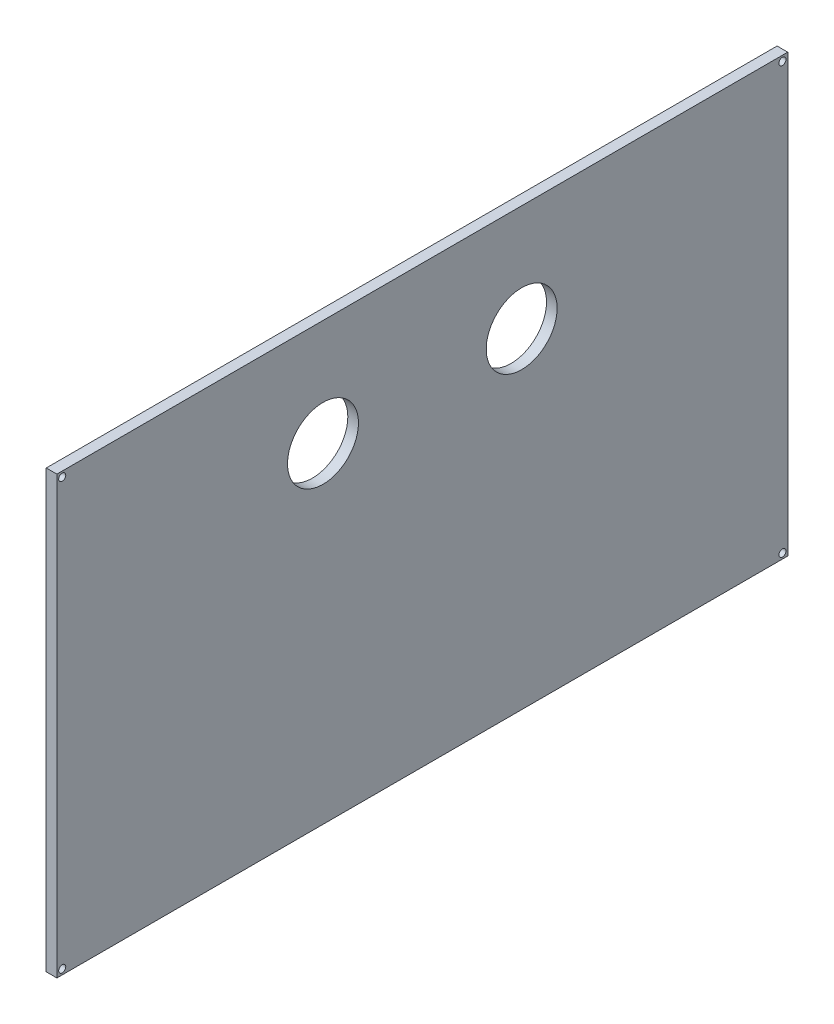
ISO-10303-21;
HEADER;
FILE_DESCRIPTION(('STEP AP214'),'2;1');
FILE_NAME('part.step','',(''),(''),'','','');
FILE_SCHEMA(('AUTOMOTIVE_DESIGN { 1 0 10303 214 1 1 1 1 }'));
ENDSEC;
DATA;
#1=APPLICATION_CONTEXT('core data for automotive mechanical design processes');
#2=APPLICATION_PROTOCOL_DEFINITION('international standard','automotive_design',2000,#1);
#3=PRODUCT_CONTEXT('',#1,'mechanical');
#4=PRODUCT('Part','Part','',(#3));
#5=PRODUCT_RELATED_PRODUCT_CATEGORY('part','',(#4));
#6=PRODUCT_DEFINITION_FORMATION('','',#4);
#7=PRODUCT_DEFINITION_CONTEXT('part definition',#1,'design');
#8=PRODUCT_DEFINITION('design','',#6,#7);
#9=PRODUCT_DEFINITION_SHAPE('','',#8);
#10=(LENGTH_UNIT() NAMED_UNIT(*) SI_UNIT(.MILLI.,.METRE.));
#11=(NAMED_UNIT(*) PLANE_ANGLE_UNIT() SI_UNIT($,.RADIAN.));
#12=(NAMED_UNIT(*) SI_UNIT($,.STERADIAN.) SOLID_ANGLE_UNIT());
#13=UNCERTAINTY_MEASURE_WITH_UNIT(LENGTH_MEASURE(1.E-05),#10,'distance_accuracy_value','');
#14=(GEOMETRIC_REPRESENTATION_CONTEXT(3) GLOBAL_UNCERTAINTY_ASSIGNED_CONTEXT((#13)) GLOBAL_UNIT_ASSIGNED_CONTEXT((#10,
#11,#12)) REPRESENTATION_CONTEXT('',''));
#15=CARTESIAN_POINT('',(0.,0.,0.));
#16=DIRECTION('',(0.,0.,1.));
#17=DIRECTION('',(1.,0.,0.));
#18=AXIS2_PLACEMENT_3D('',#15,#16,#17);
#19=CARTESIAN_POINT('',(3.,0.,0.));
#20=DIRECTION('',(-1.,0.,0.));
#21=DIRECTION('',(0.,0.,1.));
#22=AXIS2_PLACEMENT_3D('',#19,#20,#21);
#23=PLANE('',#22);
#24=DIRECTION('',(0.,-1.,0.));
#25=VECTOR('',#24,1.);
#26=CARTESIAN_POINT('',(3.,0.,0.));
#27=LINE('',#26,#25);
#28=CARTESIAN_POINT('',(3.,123.,0.));
#29=VERTEX_POINT('',#28);
#30=CARTESIAN_POINT('',(3.,0.,0.));
#31=VERTEX_POINT('',#30);
#32=EDGE_CURVE('E91',#29,#31,#27,.T.);
#33=ORIENTED_EDGE('',*,*,#32,.T.);
#34=DIRECTION('',(0.,0.,-1.));
#35=VECTOR('',#34,1.);
#36=CARTESIAN_POINT('',(3.,0.,0.));
#37=LINE('',#36,#35);
#38=CARTESIAN_POINT('',(3.,0.,-206.));
#39=VERTEX_POINT('',#38);
#40=EDGE_CURVE('E86',#31,#39,#37,.T.);
#41=ORIENTED_EDGE('',*,*,#40,.T.);
#42=DIRECTION('',(0.,1.,0.));
#43=VECTOR('',#42,1.);
#44=CARTESIAN_POINT('',(3.,0.,-206.));
#45=LINE('',#44,#43);
#46=CARTESIAN_POINT('',(3.,123.,-206.));
#47=VERTEX_POINT('',#46);
#48=EDGE_CURVE('E89',#39,#47,#45,.T.);
#49=ORIENTED_EDGE('',*,*,#48,.T.);
#50=DIRECTION('',(0.,0.,1.));
#51=VECTOR('',#50,1.);
#52=CARTESIAN_POINT('',(3.,123.,0.));
#53=LINE('',#52,#51);
#54=EDGE_CURVE('E56',#47,#29,#53,.T.);
#55=ORIENTED_EDGE('',*,*,#54,.T.);
#56=EDGE_LOOP('',(#33,#41,#49,#55));
#57=FACE_BOUND('',#56,.T.);
#58=CARTESIAN_POINT('',(3.,93.,-75.));
#59=DIRECTION('',(1.,0.,0.));
#60=DIRECTION('',(0.,0.,-1.));
#61=AXIS2_PLACEMENT_3D('',#58,#59,#60);
#62=CIRCLE('',#61,9.99999999999999);
#63=CARTESIAN_POINT('',(3.,93.,-85.));
#64=VERTEX_POINT('',#63);
#65=EDGE_CURVE('E106',#64,#64,#62,.T.);
#66=ORIENTED_EDGE('',*,*,#65,.F.);
#67=EDGE_LOOP('',(#66));
#68=FACE_BOUND('',#67,.T.);
#69=CARTESIAN_POINT('',(3.,93.,-131.));
#70=DIRECTION('',(1.,0.,0.));
#71=DIRECTION('',(0.,0.,-1.));
#72=AXIS2_PLACEMENT_3D('',#69,#70,#71);
#73=CIRCLE('',#72,10.);
#74=CARTESIAN_POINT('',(3.,93.,-141.));
#75=VERTEX_POINT('',#74);
#76=EDGE_CURVE('E121',#75,#75,#73,.T.);
#77=ORIENTED_EDGE('',*,*,#76,.F.);
#78=EDGE_LOOP('',(#77));
#79=FACE_BOUND('',#78,.T.);
#80=CARTESIAN_POINT('',(3.,1.5,-204.5));
#81=DIRECTION('',(1.,0.,0.));
#82=DIRECTION('',(0.,0.,-1.));
#83=AXIS2_PLACEMENT_3D('',#80,#81,#82);
#84=CIRCLE('',#83,0.999999999999998);
#85=CARTESIAN_POINT('',(3.,1.5,-205.5));
#86=VERTEX_POINT('',#85);
#87=EDGE_CURVE('E127',#86,#86,#84,.T.);
#88=ORIENTED_EDGE('',*,*,#87,.F.);
#89=EDGE_LOOP('',(#88));
#90=FACE_BOUND('',#89,.T.);
#91=CARTESIAN_POINT('',(3.,1.5,-1.5));
#92=DIRECTION('',(1.,0.,0.));
#93=DIRECTION('',(0.,0.,-1.));
#94=AXIS2_PLACEMENT_3D('',#91,#92,#93);
#95=CIRCLE('',#94,1.);
#96=CARTESIAN_POINT('',(3.,1.5,-2.5));
#97=VERTEX_POINT('',#96);
#98=EDGE_CURVE('E133',#97,#97,#95,.T.);
#99=ORIENTED_EDGE('',*,*,#98,.F.);
#100=EDGE_LOOP('',(#99));
#101=FACE_BOUND('',#100,.T.);
#102=CARTESIAN_POINT('',(3.,121.5,-204.5));
#103=DIRECTION('',(1.,0.,0.));
#104=DIRECTION('',(0.,0.,-1.));
#105=AXIS2_PLACEMENT_3D('',#102,#103,#104);
#106=CIRCLE('',#105,0.999999999999998);
#107=CARTESIAN_POINT('',(3.,121.5,-205.5));
#108=VERTEX_POINT('',#107);
#109=EDGE_CURVE('E139',#108,#108,#106,.T.);
#110=ORIENTED_EDGE('',*,*,#109,.F.);
#111=EDGE_LOOP('',(#110));
#112=FACE_BOUND('',#111,.T.);
#113=CARTESIAN_POINT('',(3.,121.5,-1.5));
#114=DIRECTION('',(1.,0.,0.));
#115=DIRECTION('',(0.,0.,-1.));
#116=AXIS2_PLACEMENT_3D('',#113,#114,#115);
#117=CIRCLE('',#116,1.);
#118=CARTESIAN_POINT('',(3.,121.5,-2.5));
#119=VERTEX_POINT('',#118);
#120=EDGE_CURVE('E145',#119,#119,#117,.T.);
#121=ORIENTED_EDGE('',*,*,#120,.F.);
#122=EDGE_LOOP('',(#121));
#123=FACE_BOUND('',#122,.T.);
#124=ADVANCED_FACE('F39',(#57,#68,#79,#90,#101,#112,#123),#23,.F.);
#125=CARTESIAN_POINT('',(0.,0.,0.));
#126=DIRECTION('',(-1.,0.,0.));
#127=DIRECTION('',(0.,0.,1.));
#128=AXIS2_PLACEMENT_3D('',#125,#126,#127);
#129=PLANE('',#128);
#130=CARTESIAN_POINT('',(0.,121.5,-204.5));
#131=DIRECTION('',(1.,0.,0.));
#132=DIRECTION('',(0.,0.,-1.));
#133=AXIS2_PLACEMENT_3D('',#130,#131,#132);
#134=CIRCLE('',#133,0.999999999999998);
#135=CARTESIAN_POINT('',(0.,121.5,-205.5));
#136=VERTEX_POINT('',#135);
#137=EDGE_CURVE('E142',#136,#136,#134,.T.);
#138=ORIENTED_EDGE('',*,*,#137,.T.);
#139=EDGE_LOOP('',(#138));
#140=FACE_BOUND('',#139,.T.);
#141=CARTESIAN_POINT('',(0.,1.5,-204.5));
#142=DIRECTION('',(1.,0.,0.));
#143=DIRECTION('',(0.,0.,-1.));
#144=AXIS2_PLACEMENT_3D('',#141,#142,#143);
#145=CIRCLE('',#144,0.999999999999998);
#146=CARTESIAN_POINT('',(0.,1.5,-205.5));
#147=VERTEX_POINT('',#146);
#148=EDGE_CURVE('E130',#147,#147,#145,.T.);
#149=ORIENTED_EDGE('',*,*,#148,.T.);
#150=EDGE_LOOP('',(#149));
#151=FACE_BOUND('',#150,.T.);
#152=CARTESIAN_POINT('',(0.,93.,-75.));
#153=DIRECTION('',(1.,0.,0.));
#154=DIRECTION('',(0.,0.,-1.));
#155=AXIS2_PLACEMENT_3D('',#152,#153,#154);
#156=CIRCLE('',#155,9.99999999999999);
#157=CARTESIAN_POINT('',(0.,93.,-85.));
#158=VERTEX_POINT('',#157);
#159=EDGE_CURVE('E118',#158,#158,#156,.T.);
#160=ORIENTED_EDGE('',*,*,#159,.T.);
#161=EDGE_LOOP('',(#160));
#162=FACE_BOUND('',#161,.T.);
#163=DIRECTION('',(0.,-1.,0.));
#164=VECTOR('',#163,1.);
#165=CARTESIAN_POINT('',(0.,0.,0.));
#166=LINE('',#165,#164);
#167=CARTESIAN_POINT('',(0.,123.,0.));
#168=VERTEX_POINT('',#167);
#169=CARTESIAN_POINT('',(0.,0.,0.));
#170=VERTEX_POINT('',#169);
#171=EDGE_CURVE('E103',#168,#170,#166,.T.);
#172=ORIENTED_EDGE('',*,*,#171,.F.);
#173=DIRECTION('',(0.,0.,1.));
#174=VECTOR('',#173,1.);
#175=CARTESIAN_POINT('',(0.,123.,0.));
#176=LINE('',#175,#174);
#177=CARTESIAN_POINT('',(0.,123.,-206.));
#178=VERTEX_POINT('',#177);
#179=EDGE_CURVE('E79',#178,#168,#176,.T.);
#180=ORIENTED_EDGE('',*,*,#179,.F.);
#181=DIRECTION('',(0.,1.,0.));
#182=VECTOR('',#181,1.);
#183=CARTESIAN_POINT('',(0.,0.,-206.));
#184=LINE('',#183,#182);
#185=CARTESIAN_POINT('',(0.,0.,-206.));
#186=VERTEX_POINT('',#185);
#187=EDGE_CURVE('E73',#186,#178,#184,.T.);
#188=ORIENTED_EDGE('',*,*,#187,.F.);
#189=DIRECTION('',(0.,0.,-1.));
#190=VECTOR('',#189,1.);
#191=CARTESIAN_POINT('',(0.,0.,0.));
#192=LINE('',#191,#190);
#193=EDGE_CURVE('E95',#170,#186,#192,.T.);
#194=ORIENTED_EDGE('',*,*,#193,.F.);
#195=EDGE_LOOP('',(#172,#180,#188,#194));
#196=FACE_BOUND('',#195,.T.);
#197=CARTESIAN_POINT('',(0.,93.,-131.));
#198=DIRECTION('',(1.,0.,0.));
#199=DIRECTION('',(0.,0.,-1.));
#200=AXIS2_PLACEMENT_3D('',#197,#198,#199);
#201=CIRCLE('',#200,10.);
#202=CARTESIAN_POINT('',(0.,93.,-141.));
#203=VERTEX_POINT('',#202);
#204=EDGE_CURVE('E124',#203,#203,#201,.T.);
#205=ORIENTED_EDGE('',*,*,#204,.T.);
#206=EDGE_LOOP('',(#205));
#207=FACE_BOUND('',#206,.T.);
#208=CARTESIAN_POINT('',(0.,1.5,-1.5));
#209=DIRECTION('',(1.,0.,0.));
#210=DIRECTION('',(0.,0.,-1.));
#211=AXIS2_PLACEMENT_3D('',#208,#209,#210);
#212=CIRCLE('',#211,1.);
#213=CARTESIAN_POINT('',(0.,1.5,-2.5));
#214=VERTEX_POINT('',#213);
#215=EDGE_CURVE('E136',#214,#214,#212,.T.);
#216=ORIENTED_EDGE('',*,*,#215,.T.);
#217=EDGE_LOOP('',(#216));
#218=FACE_BOUND('',#217,.T.);
#219=CARTESIAN_POINT('',(0.,121.5,-1.5));
#220=DIRECTION('',(1.,0.,0.));
#221=DIRECTION('',(0.,0.,-1.));
#222=AXIS2_PLACEMENT_3D('',#219,#220,#221);
#223=CIRCLE('',#222,1.);
#224=CARTESIAN_POINT('',(0.,121.5,-2.5));
#225=VERTEX_POINT('',#224);
#226=EDGE_CURVE('E148',#225,#225,#223,.T.);
#227=ORIENTED_EDGE('',*,*,#226,.T.);
#228=EDGE_LOOP('',(#227));
#229=FACE_BOUND('',#228,.T.);
#230=ADVANCED_FACE('F114',(#140,#151,#162,#196,#207,#218,#229),#129,.T.);
#231=CARTESIAN_POINT('',(3.,0.,0.));
#232=DIRECTION('',(0.,0.,-1.));
#233=DIRECTION('',(-1.,0.,0.));
#234=AXIS2_PLACEMENT_3D('',#231,#232,#233);
#235=PLANE('',#234);
#236=ORIENTED_EDGE('',*,*,#171,.T.);
#237=DIRECTION('',(-1.,0.,0.));
#238=VECTOR('',#237,1.);
#239=CARTESIAN_POINT('',(3.,0.,0.));
#240=LINE('',#239,#238);
#241=EDGE_CURVE('E11',#31,#170,#240,.T.);
#242=ORIENTED_EDGE('',*,*,#241,.F.);
#243=ORIENTED_EDGE('',*,*,#32,.F.);
#244=DIRECTION('',(-1.,0.,0.));
#245=VECTOR('',#244,1.);
#246=CARTESIAN_POINT('',(3.,123.,0.));
#247=LINE('',#246,#245);
#248=EDGE_CURVE('E99',#29,#168,#247,.T.);
#249=ORIENTED_EDGE('',*,*,#248,.T.);
#250=EDGE_LOOP('',(#236,#242,#243,#249));
#251=FACE_BOUND('',#250,.T.);
#252=ADVANCED_FACE('F41',(#251),#235,.F.);
#253=CARTESIAN_POINT('',(3.,0.,0.));
#254=DIRECTION('',(0.,1.,0.));
#255=DIRECTION('',(0.,0.,1.));
#256=AXIS2_PLACEMENT_3D('',#253,#254,#255);
#257=PLANE('',#256);
#258=ORIENTED_EDGE('',*,*,#193,.T.);
#259=DIRECTION('',(-1.,0.,0.));
#260=VECTOR('',#259,1.);
#261=CARTESIAN_POINT('',(3.,0.,-206.));
#262=LINE('',#261,#260);
#263=EDGE_CURVE('E48',#39,#186,#262,.T.);
#264=ORIENTED_EDGE('',*,*,#263,.F.);
#265=ORIENTED_EDGE('',*,*,#40,.F.);
#266=ORIENTED_EDGE('',*,*,#241,.T.);
#267=EDGE_LOOP('',(#258,#264,#265,#266));
#268=FACE_BOUND('',#267,.T.);
#269=ADVANCED_FACE('F94',(#268),#257,.F.);
#270=CARTESIAN_POINT('',(3.,0.,-206.));
#271=DIRECTION('',(0.,0.,1.));
#272=DIRECTION('',(1.,0.,0.));
#273=AXIS2_PLACEMENT_3D('',#270,#271,#272);
#274=PLANE('',#273);
#275=ORIENTED_EDGE('',*,*,#187,.T.);
#276=DIRECTION('',(-1.,0.,0.));
#277=VECTOR('',#276,1.);
#278=CARTESIAN_POINT('',(3.,123.,-206.));
#279=LINE('',#278,#277);
#280=EDGE_CURVE('E96',#47,#178,#279,.T.);
#281=ORIENTED_EDGE('',*,*,#280,.F.);
#282=ORIENTED_EDGE('',*,*,#48,.F.);
#283=ORIENTED_EDGE('',*,*,#263,.T.);
#284=EDGE_LOOP('',(#275,#281,#282,#283));
#285=FACE_BOUND('',#284,.T.);
#286=ADVANCED_FACE('F97',(#285),#274,.F.);
#287=CARTESIAN_POINT('',(3.,123.,0.));
#288=DIRECTION('',(0.,-1.,0.));
#289=DIRECTION('',(0.,0.,-1.));
#290=AXIS2_PLACEMENT_3D('',#287,#288,#289);
#291=PLANE('',#290);
#292=ORIENTED_EDGE('',*,*,#179,.T.);
#293=ORIENTED_EDGE('',*,*,#248,.F.);
#294=ORIENTED_EDGE('',*,*,#54,.F.);
#295=ORIENTED_EDGE('',*,*,#280,.T.);
#296=EDGE_LOOP('',(#292,#293,#294,#295));
#297=FACE_BOUND('',#296,.T.);
#298=ADVANCED_FACE('F111',(#297),#291,.F.);
#299=CARTESIAN_POINT('',(3.,93.,-75.));
#300=DIRECTION('',(-1.,0.,0.));
#301=DIRECTION('',(0.,0.,1.));
#302=AXIS2_PLACEMENT_3D('',#299,#300,#301);
#303=CYLINDRICAL_SURFACE('',#302,9.99999999999999);
#304=ORIENTED_EDGE('',*,*,#65,.T.);
#305=EDGE_LOOP('',(#304));
#306=FACE_BOUND('',#305,.T.);
#307=ORIENTED_EDGE('',*,*,#159,.F.);
#308=EDGE_LOOP('',(#307));
#309=FACE_BOUND('',#308,.T.);
#310=ADVANCED_FACE('F165',(#306,#309),#303,.F.);
#311=CARTESIAN_POINT('',(3.,93.,-131.));
#312=DIRECTION('',(-1.,0.,0.));
#313=DIRECTION('',(0.,0.,1.));
#314=AXIS2_PLACEMENT_3D('',#311,#312,#313);
#315=CYLINDRICAL_SURFACE('',#314,10.);
#316=ORIENTED_EDGE('',*,*,#76,.T.);
#317=EDGE_LOOP('',(#316));
#318=FACE_BOUND('',#317,.T.);
#319=ORIENTED_EDGE('',*,*,#204,.F.);
#320=EDGE_LOOP('',(#319));
#321=FACE_BOUND('',#320,.T.);
#322=ADVANCED_FACE('F210',(#318,#321),#315,.F.);
#323=CARTESIAN_POINT('',(3.,1.5,-204.5));
#324=DIRECTION('',(-1.,0.,0.));
#325=DIRECTION('',(0.,0.,1.));
#326=AXIS2_PLACEMENT_3D('',#323,#324,#325);
#327=CYLINDRICAL_SURFACE('',#326,0.999999999999998);
#328=ORIENTED_EDGE('',*,*,#87,.T.);
#329=EDGE_LOOP('',(#328));
#330=FACE_BOUND('',#329,.T.);
#331=ORIENTED_EDGE('',*,*,#148,.F.);
#332=EDGE_LOOP('',(#331));
#333=FACE_BOUND('',#332,.T.);
#334=ADVANCED_FACE('F218',(#330,#333),#327,.F.);
#335=CARTESIAN_POINT('',(3.,1.5,-1.5));
#336=DIRECTION('',(-1.,0.,0.));
#337=DIRECTION('',(0.,0.,1.));
#338=AXIS2_PLACEMENT_3D('',#335,#336,#337);
#339=CYLINDRICAL_SURFACE('',#338,1.);
#340=ORIENTED_EDGE('',*,*,#98,.T.);
#341=EDGE_LOOP('',(#340));
#342=FACE_BOUND('',#341,.T.);
#343=ORIENTED_EDGE('',*,*,#215,.F.);
#344=EDGE_LOOP('',(#343));
#345=FACE_BOUND('',#344,.T.);
#346=ADVANCED_FACE('F226',(#342,#345),#339,.F.);
#347=CARTESIAN_POINT('',(3.,121.5,-204.5));
#348=DIRECTION('',(-1.,0.,0.));
#349=DIRECTION('',(0.,0.,1.));
#350=AXIS2_PLACEMENT_3D('',#347,#348,#349);
#351=CYLINDRICAL_SURFACE('',#350,0.999999999999998);
#352=ORIENTED_EDGE('',*,*,#109,.T.);
#353=EDGE_LOOP('',(#352));
#354=FACE_BOUND('',#353,.T.);
#355=ORIENTED_EDGE('',*,*,#137,.F.);
#356=EDGE_LOOP('',(#355));
#357=FACE_BOUND('',#356,.T.);
#358=ADVANCED_FACE('F235',(#354,#357),#351,.F.);
#359=CARTESIAN_POINT('',(3.,121.5,-1.5));
#360=DIRECTION('',(-1.,0.,0.));
#361=DIRECTION('',(0.,0.,1.));
#362=AXIS2_PLACEMENT_3D('',#359,#360,#361);
#363=CYLINDRICAL_SURFACE('',#362,1.);
#364=ORIENTED_EDGE('',*,*,#120,.T.);
#365=EDGE_LOOP('',(#364));
#366=FACE_BOUND('',#365,.T.);
#367=ORIENTED_EDGE('',*,*,#226,.F.);
#368=EDGE_LOOP('',(#367));
#369=FACE_BOUND('',#368,.T.);
#370=ADVANCED_FACE('F154',(#366,#369),#363,.F.);
#371=CLOSED_SHELL('',(#124,#230,#252,#269,#286,#298,#310,#322,#334,#346,#358,#370));
#372=MANIFOLD_SOLID_BREP('B2',#371);
#373=ADVANCED_BREP_SHAPE_REPRESENTATION('',(#18,#372),#14);
#374=SHAPE_DEFINITION_REPRESENTATION(#9,#373);
ENDSEC;
END-ISO-10303-21;
